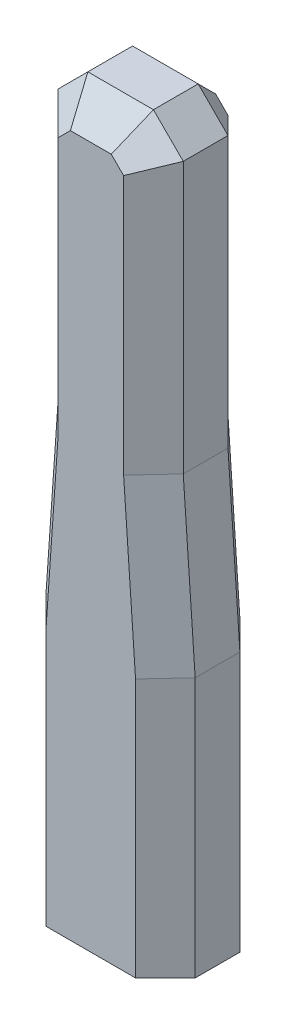
ISO-10303-21;
HEADER;
FILE_DESCRIPTION(('STEP AP214'),'2;1');
FILE_NAME('part.step','',(''),(''),'','','');
FILE_SCHEMA(('AUTOMOTIVE_DESIGN { 1 0 10303 214 1 1 1 1 }'));
ENDSEC;
DATA;
#1=APPLICATION_CONTEXT('core data for automotive mechanical design processes');
#2=APPLICATION_PROTOCOL_DEFINITION('international standard','automotive_design',2000,#1);
#3=PRODUCT_CONTEXT('',#1,'mechanical');
#4=PRODUCT('Part','Part','',(#3));
#5=PRODUCT_RELATED_PRODUCT_CATEGORY('part','',(#4));
#6=PRODUCT_DEFINITION_FORMATION('','',#4);
#7=PRODUCT_DEFINITION_CONTEXT('part definition',#1,'design');
#8=PRODUCT_DEFINITION('design','',#6,#7);
#9=PRODUCT_DEFINITION_SHAPE('','',#8);
#10=(LENGTH_UNIT() NAMED_UNIT(*) SI_UNIT(.MILLI.,.METRE.));
#11=(NAMED_UNIT(*) PLANE_ANGLE_UNIT() SI_UNIT($,.RADIAN.));
#12=(NAMED_UNIT(*) SI_UNIT($,.STERADIAN.) SOLID_ANGLE_UNIT());
#13=UNCERTAINTY_MEASURE_WITH_UNIT(LENGTH_MEASURE(1.E-05),#10,'distance_accuracy_value','');
#14=(GEOMETRIC_REPRESENTATION_CONTEXT(3) GLOBAL_UNCERTAINTY_ASSIGNED_CONTEXT((#13)) GLOBAL_UNIT_ASSIGNED_CONTEXT((#10,
#11,#12)) REPRESENTATION_CONTEXT('',''));
#15=CARTESIAN_POINT('',(0.,0.,0.));
#16=DIRECTION('',(0.,0.,1.));
#17=DIRECTION('',(1.,0.,0.));
#18=AXIS2_PLACEMENT_3D('',#15,#16,#17);
#19=CARTESIAN_POINT('',(-4.57999866713436,9.57202758637888,-16.9305140200779));
#20=DIRECTION('',(-0.707106781202286,0.,0.707106781170809));
#21=DIRECTION('',(0.,1.,0.));
#22=AXIS2_PLACEMENT_3D('',#19,#20,#21);
#23=PLANE('',#22);
#24=DIRECTION('',(0.,1.,0.));
#25=VECTOR('',#24,1.);
#26=CARTESIAN_POINT('',(-4.67999866713065,9.57202758637888,-17.0305140200786));
#27=LINE('',#26,#25);
#28=CARTESIAN_POINT('',(-4.67999866713065,8.65707008336893,-17.0305140200786));
#29=VERTEX_POINT('',#28);
#30=CARTESIAN_POINT('',(-4.67999866713065,10.39715822302,-17.0305140200786));
#31=VERTEX_POINT('',#30);
#32=EDGE_CURVE('E241',#29,#31,#27,.T.);
#33=ORIENTED_EDGE('',*,*,#32,.T.);
#34=DIRECTION('',(-0.678598344529951,-0.281084637718644,-0.678598344560159));
#35=VECTOR('',#34,1.);
#36=CARTESIAN_POINT('',(12.3505153521898,17.4514281042689,0.));
#37=LINE('',#36,#35);
#38=CARTESIAN_POINT('',(-4.47999866713806,10.4800009354946,-16.8305140200771));
#39=VERTEX_POINT('',#38);
#40=EDGE_CURVE('E11',#39,#31,#37,.T.);
#41=ORIENTED_EDGE('',*,*,#40,.F.);
#42=DIRECTION('',(0.,1.,0.));
#43=VECTOR('',#42,1.);
#44=CARTESIAN_POINT('',(-4.47999866713806,9.57202758637888,-16.8305140200771));
#45=LINE('',#44,#43);
#46=CARTESIAN_POINT('',(-4.47999866713806,8.66405423734772,-16.8305140200771));
#47=VERTEX_POINT('',#46);
#48=EDGE_CURVE('E342',#47,#39,#45,.T.);
#49=ORIENTED_EDGE('',*,*,#48,.F.);
#50=DIRECTION('',(0.706891307562466,0.0246851886921346,0.706891307593933));
#51=VECTOR('',#50,1.);
#52=CARTESIAN_POINT('',(12.3505153521898,9.25178874463048,0.));
#53=LINE('',#52,#51);
#54=EDGE_CURVE('E278',#29,#47,#53,.T.);
#55=ORIENTED_EDGE('',*,*,#54,.F.);
#56=EDGE_LOOP('',(#33,#41,#49,#55));
#57=FACE_BOUND('',#56,.T.);
#58=ADVANCED_FACE('F17',(#57),#23,.F.);
#59=CARTESIAN_POINT('',(-5.26024226203781,8.0850519393985,-16.9305140200829));
#60=DIRECTION('',(0.705384304599317,-0.0493252756452176,0.707106781191823));
#61=DIRECTION('',(-0.0697564737857785,-0.997564050256912,0.));
#62=AXIS2_PLACEMENT_3D('',#59,#60,#61);
#63=PLANE('',#62);
#64=DIRECTION('',(-0.0697564737852584,-0.997564050256948,-5.21242771167607E-13));
#65=VECTOR('',#64,1.);
#66=CARTESIAN_POINT('',(-5.16048585701137,8.07807629201998,-17.0305140200822));
#67=LINE('',#66,#65);
#68=CARTESIAN_POINT('',(-5.11999866703897,8.65707008314429,-17.0305140200819));
#69=VERTEX_POINT('',#68);
#70=CARTESIAN_POINT('',(-5.19999866708669,7.51301678260294,-17.0305140200825));
#71=VERTEX_POINT('',#70);
#72=EDGE_CURVE('E219',#69,#71,#67,.T.);
#73=ORIENTED_EDGE('',*,*,#72,.T.);
#74=DIRECTION('',(-0.706891307599591,0.0246851882049609,0.706891307573821));
#75=VECTOR('',#74,1.);
#76=CARTESIAN_POINT('',(0.,7.33142882928878,-22.2305126869796));
#77=LINE('',#76,#75);
#78=CARTESIAN_POINT('',(-5.39999866709248,7.52000093644391,-16.830514020084));
#79=VERTEX_POINT('',#78);
#80=EDGE_CURVE('E320',#71,#79,#77,.T.);
#81=ORIENTED_EDGE('',*,*,#80,.T.);
#82=DIRECTION('',(-0.0697564737852584,-0.997564050256948,-5.21242771167607E-13));
#83=VECTOR('',#82,1.);
#84=CARTESIAN_POINT('',(-5.35999866706426,8.09202758677703,-16.8305140200837));
#85=LINE('',#84,#83);
#86=CARTESIAN_POINT('',(-5.31999866704638,8.66405423696218,-16.8305140200834));
#87=VERTEX_POINT('',#86);
#88=EDGE_CURVE('E285',#87,#79,#85,.T.);
#89=ORIENTED_EDGE('',*,*,#88,.F.);
#90=DIRECTION('',(-0.706891307603859,0.024685188123522,0.706891307572397));
#91=VECTOR('',#90,1.);
#92=CARTESIAN_POINT('',(0.,8.47827579195905,-22.150512686893));
#93=LINE('',#92,#91);
#94=EDGE_CURVE('E468',#69,#87,#93,.T.);
#95=ORIENTED_EDGE('',*,*,#94,.F.);
#96=EDGE_LOOP('',(#73,#81,#89,#95));
#97=FACE_BOUND('',#96,.T.);
#98=ADVANCED_FACE('F730',(#97),#63,.F.);
#99=CARTESIAN_POINT('',(-5.14928798892254,10.5092902573774,-16.9305140200821));
#100=DIRECTION('',(0.499999999989489,-0.499999999994773,0.707106781197676));
#101=DIRECTION('',(-0.707106781190284,-0.707106781182811,0.));
#102=AXIS2_PLACEMENT_3D('',#99,#100,#101);
#103=PLANE('',#102);
#104=DIRECTION('',(-0.707106781186548,-0.707106781186547,-5.28366239649358E-12));
#105=VECTOR('',#104,1.);
#106=CARTESIAN_POINT('',(-5.07857731080166,10.4385795792573,-17.0305140200816));
#107=LINE('',#106,#105);
#108=CARTESIAN_POINT('',(-5.03715595456435,10.4800009354946,-17.0305140200813));
#109=VERTEX_POINT('',#108);
#110=CARTESIAN_POINT('',(-5.11999866703897,10.39715822302,-17.0305140200819));
#111=VERTEX_POINT('',#110);
#112=EDGE_CURVE('E218',#109,#111,#107,.T.);
#113=ORIENTED_EDGE('',*,*,#112,.T.);
#114=DIRECTION('',(-0.67859834456174,0.281084637710999,0.678598344531538));
#115=VECTOR('',#114,1.);
#116=CARTESIAN_POINT('',(0.,8.27638533587879,-22.150512686893));
#117=LINE('',#116,#115);
#118=CARTESIAN_POINT('',(-5.31999866704638,10.4800009354946,-16.8305140200834));
#119=VERTEX_POINT('',#118);
#120=EDGE_CURVE('E228',#111,#119,#117,.T.);
#121=ORIENTED_EDGE('',*,*,#120,.T.);
#122=DIRECTION('',(-0.707106781186548,-0.707106781186547,-5.28366239649358E-12));
#123=VECTOR('',#122,1.);
#124=CARTESIAN_POINT('',(-5.21999866704342,10.5800009354976,-16.8305140200826));
#125=LINE('',#124,#123);
#126=CARTESIAN_POINT('',(-5.11999866704638,10.6800009354946,-16.8305140200819));
#127=VERTEX_POINT('',#126);
#128=EDGE_CURVE('E186',#127,#119,#125,.T.);
#129=ORIENTED_EDGE('',*,*,#128,.F.);
#130=DIRECTION('',(0.281084637738371,-0.67859834454202,-0.678598344539919));
#131=VECTOR('',#130,1.);
#132=CARTESIAN_POINT('',(-0.696197433011564,0.,-27.5105149555435));
#133=LINE('',#132,#131);
#134=EDGE_CURVE('E272',#127,#109,#133,.T.);
#135=ORIENTED_EDGE('',*,*,#134,.T.);
#136=EDGE_LOOP('',(#113,#121,#129,#135));
#137=FACE_BOUND('',#136,.T.);
#138=ADVANCED_FACE('F709',(#137),#103,.F.);
#139=CARTESIAN_POINT('',(-4.65070934525154,10.5092902573745,-16.9305140200784));
#140=DIRECTION('',(-0.500000000010512,-0.500000000005229,0.707106781175417));
#141=DIRECTION('',(-0.707106781182812,0.707106781190283,0.));
#142=AXIS2_PLACEMENT_3D('',#139,#140,#141);
#143=PLANE('',#142);
#144=DIRECTION('',(-0.707106781186548,0.707106781186547,-5.2836901520692E-12));
#145=VECTOR('',#144,1.);
#146=CARTESIAN_POINT('',(-4.72142002336796,10.4385795792573,-17.0305140200789));
#147=LINE('',#146,#145);
#148=CARTESIAN_POINT('',(-4.76284137960527,10.4800009354946,-17.0305140200792));
#149=VERTEX_POINT('',#148);
#150=EDGE_CURVE('E237',#31,#149,#147,.T.);
#151=ORIENTED_EDGE('',*,*,#150,.T.);
#152=DIRECTION('',(0.281084637691265,0.678598344549675,0.678598344551776));
#153=VECTOR('',#152,1.);
#154=CARTESIAN_POINT('',(2.29142850104388,27.5105149555211,0.));
#155=LINE('',#154,#153);
#156=CARTESIAN_POINT('',(-4.67999866713806,10.6800009354946,-16.8305140200786));
#157=VERTEX_POINT('',#156);
#158=EDGE_CURVE('E28',#149,#157,#155,.T.);
#159=ORIENTED_EDGE('',*,*,#158,.T.);
#160=DIRECTION('',(-0.707106781186548,0.707106781186547,-5.2836901520692E-12));
#161=VECTOR('',#160,1.);
#162=CARTESIAN_POINT('',(-4.57999866713511,10.5800009354917,-16.8305140200779));
#163=LINE('',#162,#161);
#164=EDGE_CURVE('E367',#39,#157,#163,.T.);
#165=ORIENTED_EDGE('',*,*,#164,.F.);
#166=ORIENTED_EDGE('',*,*,#40,.T.);
#167=EDGE_LOOP('',(#151,#159,#165,#166));
#168=FACE_BOUND('',#167,.T.);
#169=ADVANCED_FACE('F740',(#168),#143,.F.);
#170=CARTESIAN_POINT('',(-4.49999866707397,6.80355429917033,-16.9305140200773));
#171=DIRECTION('',(0.707106781191832,-2.91564166507091E-11,-0.707106781181263));
#172=DIRECTION('',(0.,-1.,4.12333998579417E-11));
#173=AXIS2_PLACEMENT_3D('',#170,#171,#172);
#174=PLANE('',#173);
#175=DIRECTION('',(4.12333998576334E-11,1.,0.));
#176=VECTOR('',#175,1.);
#177=CARTESIAN_POINT('',(-4.59999866735376,0.,-17.030514020078));
#178=LINE('',#177,#176);
#179=CARTESIAN_POINT('',(-4.59999866711559,5.77610154549438,-17.030514020078));
#180=VERTEX_POINT('',#179);
#181=CARTESIAN_POINT('',(-4.59999866704398,7.51301678091455,-17.030514020078));
#182=VERTEX_POINT('',#181);
#183=EDGE_CURVE('E229',#180,#182,#178,.T.);
#184=ORIENTED_EDGE('',*,*,#183,.T.);
#185=DIRECTION('',(-0.706891307578902,-0.0246851883784887,-0.70689130758845));
#186=VECTOR('',#185,1.);
#187=CARTESIAN_POINT('',(12.430515352804,8.10773543462429,0.));
#188=LINE('',#187,#186);
#189=CARTESIAN_POINT('',(-4.39999866704518,7.5200009348046,-16.8305140200765));
#190=VERTEX_POINT('',#189);
#191=EDGE_CURVE('E277',#190,#182,#188,.T.);
#192=ORIENTED_EDGE('',*,*,#191,.F.);
#193=DIRECTION('',(4.12333998576334E-11,1.,0.));
#194=VECTOR('',#193,1.);
#195=CARTESIAN_POINT('',(-4.39999866735525,0.,-16.8305140200765));
#196=LINE('',#195,#194);
#197=CARTESIAN_POINT('',(-4.39999866711709,5.77610154549033,-16.8305140200765));
#198=VERTEX_POINT('',#197);
#199=EDGE_CURVE('E250',#198,#190,#196,.T.);
#200=ORIENTED_EDGE('',*,*,#199,.F.);
#201=DIRECTION('',(0.707106781181263,-1.43135781005554E-11,0.707106781191832));
#202=VECTOR('',#201,1.);
#203=CARTESIAN_POINT('',(12.430515352712,5.77610154514964,0.));
#204=LINE('',#203,#202);
#205=EDGE_CURVE('E296',#180,#198,#204,.T.);
#206=ORIENTED_EDGE('',*,*,#205,.F.);
#207=EDGE_LOOP('',(#184,#192,#200,#206));
#208=FACE_BOUND('',#207,.T.);
#209=ADVANCED_FACE('F449',(#208),#174,.T.);
#210=CARTESIAN_POINT('',(-4.89999866708556,10.5800009354946,-16.9305140200802));
#211=DIRECTION('',(5.28373977072025E-12,0.707106781186548,-0.707106781186548));
#212=DIRECTION('',(-1.,0.,-7.47233644380268E-12));
#213=AXIS2_PLACEMENT_3D('',#210,#211,#212);
#214=PLANE('',#213);
#215=DIRECTION('',(1.,0.,7.47224236090572E-12));
#216=VECTOR('',#215,1.);
#217=CARTESIAN_POINT('',(-4.89999866708481,10.4800009354946,-17.0305140200802));
#218=LINE('',#217,#216);
#219=EDGE_CURVE('E242',#109,#149,#218,.T.);
#220=ORIENTED_EDGE('',*,*,#219,.F.);
#221=ORIENTED_EDGE('',*,*,#134,.F.);
#222=DIRECTION('',(1.,0.,7.47224236090572E-12));
#223=VECTOR('',#222,1.);
#224=CARTESIAN_POINT('',(-4.89999866708631,10.6800009354946,-16.8305140200802));
#225=LINE('',#224,#223);
#226=EDGE_CURVE('E263',#127,#157,#225,.T.);
#227=ORIENTED_EDGE('',*,*,#226,.T.);
#228=ORIENTED_EDGE('',*,*,#158,.F.);
#229=EDGE_LOOP('',(#220,#221,#227,#228));
#230=FACE_BOUND('',#229,.T.);
#231=ADVANCED_FACE('F705',(#230),#214,.T.);
#232=CARTESIAN_POINT('',(-5.29999866710318,6.8035543000141,-16.9305140200832));
#233=DIRECTION('',(-0.707106781173423,1.34839291616587E-11,-0.707106781199672));
#234=DIRECTION('',(-0.707106781199672,0.,0.707106781173423));
#235=AXIS2_PLACEMENT_3D('',#232,#233,#234);
#236=PLANE('',#235);
#237=DIRECTION('',(0.707106781199672,-1.43124956331064E-11,-0.707106781173423));
#238=VECTOR('',#237,1.);
#239=CARTESIAN_POINT('',(-4.04831723699317E-12,5.77610154540127,-22.2305126870054));
#240=LINE('',#239,#238);
#241=CARTESIAN_POINT('',(-5.39999866712573,5.77610154551057,-16.830514020084));
#242=VERTEX_POINT('',#241);
#243=CARTESIAN_POINT('',(-5.19999866711992,5.77610154550652,-17.0305140200824));
#244=VERTEX_POINT('',#243);
#245=EDGE_CURVE('E326',#242,#244,#240,.T.);
#246=ORIENTED_EDGE('',*,*,#245,.F.);
#247=DIRECTION('',(1.90691554947072E-11,1.,0.));
#248=VECTOR('',#247,1.);
#249=CARTESIAN_POINT('',(-5.39999866710614,6.80355430001601,-16.830514020084));
#250=LINE('',#249,#248);
#251=EDGE_CURVE('E236',#242,#79,#250,.T.);
#252=ORIENTED_EDGE('',*,*,#251,.T.);
#253=ORIENTED_EDGE('',*,*,#80,.F.);
#254=DIRECTION('',(1.90691554947072E-11,1.,0.));
#255=VECTOR('',#254,1.);
#256=CARTESIAN_POINT('',(-5.19999866722995,0.,-17.0305140200825));
#257=LINE('',#256,#255);
#258=EDGE_CURVE('E224',#244,#71,#257,.T.);
#259=ORIENTED_EDGE('',*,*,#258,.F.);
#260=EDGE_LOOP('',(#246,#252,#253,#259));
#261=FACE_BOUND('',#260,.T.);
#262=ADVANCED_FACE('F439',(#261),#236,.T.);
#263=CARTESIAN_POINT('',(-4.49999866707771,6.80355429917033,-16.4305140200773));
#264=DIRECTION('',(-0.707106781181261,2.91564166507089E-11,-0.707106781191834));
#265=DIRECTION('',(-0.707106781191834,0.,0.707106781181261));
#266=AXIS2_PLACEMENT_3D('',#263,#264,#265);
#267=PLANE('',#266);
#268=DIRECTION('',(0.707106781191834,-1.43124956331064E-11,-0.707106781181261));
#269=VECTOR('',#268,1.);
#270=CARTESIAN_POINT('',(0.,5.77610154540127,-20.93051268713));
#271=LINE('',#270,#269);
#272=CARTESIAN_POINT('',(-4.59999866712083,5.77610154549438,-16.330514020078));
#273=VERTEX_POINT('',#272);
#274=CARTESIAN_POINT('',(-4.39999866711933,5.77610154549033,-16.5305140200765));
#275=VERTEX_POINT('',#274);
#276=EDGE_CURVE('E295',#273,#275,#271,.T.);
#277=ORIENTED_EDGE('',*,*,#276,.T.);
#278=DIRECTION('',(4.12333998576334E-11,1.,0.));
#279=VECTOR('',#278,1.);
#280=CARTESIAN_POINT('',(-4.3999986673575,0.,-16.5305140200765));
#281=LINE('',#280,#279);
#282=CARTESIAN_POINT('',(-4.39999866704743,7.52000093480464,-16.5305140200765));
#283=VERTEX_POINT('',#282);
#284=EDGE_CURVE('E253',#275,#283,#281,.T.);
#285=ORIENTED_EDGE('',*,*,#284,.T.);
#286=DIRECTION('',(-0.706891307589463,-0.0246851883788581,0.706891307577876));
#287=VECTOR('',#286,1.);
#288=CARTESIAN_POINT('',(0.,7.67365227383889,-20.9305126870518));
#289=LINE('',#288,#287);
#290=CARTESIAN_POINT('',(-4.5999986670492,7.5130167809145,-16.330514020078));
#291=VERTEX_POINT('',#290);
#292=EDGE_CURVE('E211',#283,#291,#289,.T.);
#293=ORIENTED_EDGE('',*,*,#292,.T.);
#294=DIRECTION('',(4.12333998576334E-11,1.,0.));
#295=VECTOR('',#294,1.);
#296=CARTESIAN_POINT('',(-4.59999866735899,0.,-16.330514020078));
#297=LINE('',#296,#295);
#298=EDGE_CURVE('E264',#273,#291,#297,.T.);
#299=ORIENTED_EDGE('',*,*,#298,.F.);
#300=EDGE_LOOP('',(#277,#285,#293,#299));
#301=FACE_BOUND('',#300,.T.);
#302=ADVANCED_FACE('F485',(#301),#267,.F.);
#303=CARTESIAN_POINT('',(-4.89999866711,10.5800009354946,-16.4305140200802));
#304=DIRECTION('',(5.28360671741137E-12,-0.707106781186548,-0.707106781186548));
#305=DIRECTION('',(0.,-0.707106781186548,0.707106781186548));
#306=AXIS2_PLACEMENT_3D('',#303,#304,#305);
#307=PLANE('',#306);
#308=DIRECTION('',(1.,0.,7.47224236090572E-12));
#309=VECTOR('',#308,1.);
#310=CARTESIAN_POINT('',(-4.89999866711074,10.4800009354946,-16.3305140200802));
#311=LINE('',#310,#309);
#312=CARTESIAN_POINT('',(-5.03715595459028,10.4800009354946,-16.3305140200813));
#313=VERTEX_POINT('',#312);
#314=CARTESIAN_POINT('',(-4.76284137963121,10.4800009354946,-16.3305140200792));
#315=VERTEX_POINT('',#314);
#316=EDGE_CURVE('E208',#313,#315,#311,.T.);
#317=ORIENTED_EDGE('',*,*,#316,.T.);
#318=DIRECTION('',(0.281084637738384,0.678598344542017,-0.678598344539917));
#319=VECTOR('',#318,1.);
#320=CARTESIAN_POINT('',(-9.10379990118421,0.,-5.85051308461704));
#321=LINE('',#320,#319);
#322=CARTESIAN_POINT('',(-4.67999866714918,10.6800009354946,-16.5305140200786));
#323=VERTEX_POINT('',#322);
#324=EDGE_CURVE('E73',#315,#323,#321,.T.);
#325=ORIENTED_EDGE('',*,*,#324,.T.);
#326=DIRECTION('',(1.,0.,7.47224236090572E-12));
#327=VECTOR('',#326,1.);
#328=CARTESIAN_POINT('',(-4.89999866710925,10.6800009354946,-16.5305140200802));
#329=LINE('',#328,#327);
#330=CARTESIAN_POINT('',(-5.11999866705749,10.6800009354946,-16.5305140200819));
#331=VERTEX_POINT('',#330);
#332=EDGE_CURVE('E262',#331,#323,#329,.T.);
#333=ORIENTED_EDGE('',*,*,#332,.F.);
#334=DIRECTION('',(0.28108463769128,-0.678598344549672,0.678598344551773));
#335=VECTOR('',#334,1.);
#336=CARTESIAN_POINT('',(1.72716443242579,-5.85051308453611,0.));
#337=LINE('',#336,#335);
#338=EDGE_CURVE('E246',#331,#313,#337,.T.);
#339=ORIENTED_EDGE('',*,*,#338,.T.);
#340=EDGE_LOOP('',(#317,#325,#333,#339));
#341=FACE_BOUND('',#340,.T.);
#342=ADVANCED_FACE('F715',(#341),#307,.F.);
#343=CARTESIAN_POINT('',(-4.53975507212827,8.08505193881158,-16.4305140200776));
#344=DIRECTION('',(0.705384304603381,0.0493252755870465,0.707106781191827));
#345=DIRECTION('',(0.0697564737035125,-0.997564050262664,0.));
#346=AXIS2_PLACEMENT_3D('',#343,#344,#345);
#347=PLANE('',#346);
#348=DIRECTION('',(-0.0697564737029925,0.9975640502627,-5.21235832273703E-13));
#349=VECTOR('',#348,1.);
#350=CARTESIAN_POINT('',(-4.63951147715529,8.07807629144128,-16.3305140200783));
#351=LINE('',#350,#349);
#352=CARTESIAN_POINT('',(-4.67999866715658,8.65707008366494,-16.3305140200786));
#353=VERTEX_POINT('',#352);
#354=EDGE_CURVE('E268',#291,#353,#351,.T.);
#355=ORIENTED_EDGE('',*,*,#354,.F.);
#356=ORIENTED_EDGE('',*,*,#292,.F.);
#357=DIRECTION('',(-0.0697564737029925,0.9975640502627,-5.21235832273703E-13));
#358=VECTOR('',#357,1.);
#359=CARTESIAN_POINT('',(-4.43999866710125,8.09202758618188,-16.5305140200768));
#360=LINE('',#359,#358);
#361=CARTESIAN_POINT('',(-4.47999866714917,8.66405423747462,-16.5305140200771));
#362=VERTEX_POINT('',#361);
#363=EDGE_CURVE('E235',#283,#362,#360,.T.);
#364=ORIENTED_EDGE('',*,*,#363,.T.);
#365=DIRECTION('',(-0.706891307604378,-0.0246851880942514,0.7068913075729));
#366=VECTOR('',#365,1.);
#367=CARTESIAN_POINT('',(0.,8.82049923626143,-21.0105126870268));
#368=LINE('',#367,#366);
#369=EDGE_CURVE('E249',#362,#353,#368,.T.);
#370=ORIENTED_EDGE('',*,*,#369,.T.);
#371=EDGE_LOOP('',(#355,#356,#364,#370));
#372=FACE_BOUND('',#371,.T.);
#373=ADVANCED_FACE('F402',(#372),#347,.T.);
#374=CARTESIAN_POINT('',(-5.2199986670612,9.57202758612268,-16.4305140200826));
#375=DIRECTION('',(-0.70710678120228,0.,0.707106781170815));
#376=DIRECTION('',(0.,1.,0.));
#377=AXIS2_PLACEMENT_3D('',#374,#375,#376);
#378=PLANE('',#377);
#379=DIRECTION('',(0.,-1.,0.));
#380=VECTOR('',#379,1.);
#381=CARTESIAN_POINT('',(-5.1199986670649,9.57202758612268,-16.3305140200819));
#382=LINE('',#381,#380);
#383=CARTESIAN_POINT('',(-5.1199986670649,10.39715822302,-16.3305140200819));
#384=VERTEX_POINT('',#383);
#385=CARTESIAN_POINT('',(-5.1199986670649,8.65707008284827,-16.3305140200819));
#386=VERTEX_POINT('',#385);
#387=EDGE_CURVE('E177',#384,#386,#382,.T.);
#388=ORIENTED_EDGE('',*,*,#387,.F.);
#389=DIRECTION('',(0.678598344529956,-0.281084637718647,0.678598344560153));
#390=VECTOR('',#389,1.);
#391=CARTESIAN_POINT('',(11.2105153522903,3.63283783542861,0.));
#392=LINE('',#391,#390);
#393=CARTESIAN_POINT('',(-5.3199986670575,10.4800009354946,-16.5305140200834));
#394=VERTEX_POINT('',#393);
#395=EDGE_CURVE('E42',#394,#384,#392,.T.);
#396=ORIENTED_EDGE('',*,*,#395,.F.);
#397=DIRECTION('',(0.,-1.,0.));
#398=VECTOR('',#397,1.);
#399=CARTESIAN_POINT('',(-5.31999866705749,9.57202758612268,-16.5305140200834));
#400=LINE('',#399,#398);
#401=CARTESIAN_POINT('',(-5.31999866705749,8.66405423683532,-16.5305140200834));
#402=VERTEX_POINT('',#401);
#403=EDGE_CURVE('E180',#394,#402,#400,.T.);
#404=ORIENTED_EDGE('',*,*,#403,.T.);
#405=DIRECTION('',(0.706891307561959,-0.0246851887215383,0.706891307593414));
#406=VECTOR('',#405,1.);
#407=CARTESIAN_POINT('',(11.2105153522903,8.0867959598323,0.));
#408=LINE('',#407,#406);
#409=EDGE_CURVE('E173',#402,#386,#408,.T.);
#410=ORIENTED_EDGE('',*,*,#409,.T.);
#411=EDGE_LOOP('',(#388,#396,#404,#410));
#412=FACE_BOUND('',#411,.T.);
#413=ADVANCED_FACE('F175',(#412),#378,.T.);
#414=CARTESIAN_POINT('',(-5.29999866711799,6.80355429990317,-16.4305140200832));
#415=DIRECTION('',(0.707106781199667,-1.34839291619576E-11,-0.707106781173428));
#416=DIRECTION('',(0.,-1.,1.90691554952723E-11));
#417=AXIS2_PLACEMENT_3D('',#414,#415,#416);
#418=PLANE('',#417);
#419=DIRECTION('',(1.90691554947072E-11,1.,0.));
#420=VECTOR('',#419,1.);
#421=CARTESIAN_POINT('',(-5.1999986672507,0.,-16.3305140200825));
#422=LINE('',#421,#420);
#423=CARTESIAN_POINT('',(-5.19999866714055,5.77610154550652,-16.3305140200825));
#424=VERTEX_POINT('',#423);
#425=CARTESIAN_POINT('',(-5.19999866710743,7.51301678238104,-16.3305140200825));
#426=VERTEX_POINT('',#425);
#427=EDGE_CURVE('E195',#424,#426,#422,.T.);
#428=ORIENTED_EDGE('',*,*,#427,.T.);
#429=DIRECTION('',(-0.706891307565523,0.0246851886535264,-0.706891307592225));
#430=VECTOR('',#429,1.);
#431=CARTESIAN_POINT('',(11.1305153523582,6.94274266093529,0.));
#432=LINE('',#431,#430);
#433=CARTESIAN_POINT('',(-5.39999866710137,7.52000093634887,-16.530514020084));
#434=VERTEX_POINT('',#433);
#435=EDGE_CURVE('E185',#426,#434,#432,.T.);
#436=ORIENTED_EDGE('',*,*,#435,.T.);
#437=DIRECTION('',(1.90691554947072E-11,1.,0.));
#438=VECTOR('',#437,1.);
#439=CARTESIAN_POINT('',(-5.39999866711503,6.80355429990507,-16.530514020084));
#440=LINE('',#439,#438);
#441=CARTESIAN_POINT('',(-5.39999866713463,5.77610154551057,-16.530514020084));
#442=VERTEX_POINT('',#441);
#443=EDGE_CURVE('E231',#442,#434,#440,.T.);
#444=ORIENTED_EDGE('',*,*,#443,.F.);
#445=DIRECTION('',(0.707106781173428,-1.43135781005554E-11,0.707106781199667));
#446=VECTOR('',#445,1.);
#447=CARTESIAN_POINT('',(11.1305153523359,5.77610154517595,0.));
#448=LINE('',#447,#446);
#449=EDGE_CURVE('E21',#442,#424,#448,.T.);
#450=ORIENTED_EDGE('',*,*,#449,.T.);
#451=EDGE_LOOP('',(#428,#436,#444,#450));
#452=FACE_BOUND('',#451,.T.);
#453=ADVANCED_FACE('F496',(#452),#418,.F.);
#454=CARTESIAN_POINT('',(-5.14928798894402,10.5092902573745,-16.4305140200821));
#455=DIRECTION('',(-0.500000000010507,0.500000000005224,0.707106781175424));
#456=DIRECTION('',(0.707106781182812,0.707106781190283,0.));
#457=AXIS2_PLACEMENT_3D('',#454,#455,#456);
#458=PLANE('',#457);
#459=DIRECTION('',(-0.707106781186548,-0.707106781186547,-5.28366239649358E-12));
#460=VECTOR('',#459,1.);
#461=CARTESIAN_POINT('',(-5.07857731082759,10.4385795792573,-16.3305140200816));
#462=LINE('',#461,#460);
#463=EDGE_CURVE('E201',#313,#384,#462,.T.);
#464=ORIENTED_EDGE('',*,*,#463,.F.);
#465=ORIENTED_EDGE('',*,*,#338,.F.);
#466=DIRECTION('',(-0.707106781186548,-0.707106781186547,-5.28366239649358E-12));
#467=VECTOR('',#466,1.);
#468=CARTESIAN_POINT('',(-5.21999866706045,10.5800009354917,-16.5305140200826));
#469=LINE('',#468,#467);
#470=EDGE_CURVE('E303',#331,#394,#469,.T.);
#471=ORIENTED_EDGE('',*,*,#470,.T.);
#472=ORIENTED_EDGE('',*,*,#395,.T.);
#473=EDGE_LOOP('',(#464,#465,#471,#472));
#474=FACE_BOUND('',#473,.T.);
#475=ADVANCED_FACE('F714',(#474),#458,.T.);
#476=CARTESIAN_POINT('',(-4.57999866715288,9.57202758652688,-16.4305140200779));
#477=DIRECTION('',(0.707106781170804,0.,0.707106781202291));
#478=DIRECTION('',(0.,-1.,0.));
#479=AXIS2_PLACEMENT_3D('',#476,#477,#478);
#480=PLANE('',#479);
#481=DIRECTION('',(0.,1.,0.));
#482=VECTOR('',#481,1.);
#483=CARTESIAN_POINT('',(-4.67999866715658,9.57202758652688,-16.3305140200786));
#484=LINE('',#483,#482);
#485=CARTESIAN_POINT('',(-4.67999866715658,10.39715822302,-16.3305140200786));
#486=VERTEX_POINT('',#485);
#487=EDGE_CURVE('E489',#353,#486,#484,.T.);
#488=ORIENTED_EDGE('',*,*,#487,.F.);
#489=ORIENTED_EDGE('',*,*,#369,.F.);
#490=DIRECTION('',(0.,1.,0.));
#491=VECTOR('',#490,1.);
#492=CARTESIAN_POINT('',(-4.47999866714917,9.57202758652688,-16.5305140200771));
#493=LINE('',#492,#491);
#494=CARTESIAN_POINT('',(-4.47999866714917,10.4800009354946,-16.5305140200771));
#495=VERTEX_POINT('',#494);
#496=EDGE_CURVE('E307',#362,#495,#493,.T.);
#497=ORIENTED_EDGE('',*,*,#496,.T.);
#498=DIRECTION('',(0.678598344561748,0.281084637710995,-0.678598344531531));
#499=VECTOR('',#498,1.);
#500=CARTESIAN_POINT('',(0.,12.3356771427724,-21.0105126870268));
#501=LINE('',#500,#499);
#502=EDGE_CURVE('E89',#486,#495,#501,.T.);
#503=ORIENTED_EDGE('',*,*,#502,.F.);
#504=EDGE_LOOP('',(#488,#489,#497,#503));
#505=FACE_BOUND('',#504,.T.);
#506=ADVANCED_FACE('F716',(#505),#480,.T.);
#507=CARTESIAN_POINT('',(-4.65070934527301,10.5092902573774,-16.4305140200784));
#508=DIRECTION('',(0.499999999989485,0.499999999994769,0.707106781197681));
#509=DIRECTION('',(0.707106781190284,-0.707106781182811,0.));
#510=AXIS2_PLACEMENT_3D('',#507,#508,#509);
#511=PLANE('',#510);
#512=DIRECTION('',(-0.707106781186548,0.707106781186547,-5.2836901520692E-12));
#513=VECTOR('',#512,1.);
#514=CARTESIAN_POINT('',(-4.72142002339389,10.4385795792573,-16.3305140200789));
#515=LINE('',#514,#513);
#516=EDGE_CURVE('E476',#486,#315,#515,.T.);
#517=ORIENTED_EDGE('',*,*,#516,.F.);
#518=ORIENTED_EDGE('',*,*,#502,.T.);
#519=DIRECTION('',(-0.707106781186548,0.707106781186547,-5.2836901520692E-12));
#520=VECTOR('',#519,1.);
#521=CARTESIAN_POINT('',(-4.57999866715213,10.5800009354976,-16.5305140200779));
#522=LINE('',#521,#520);
#523=EDGE_CURVE('E315',#495,#323,#522,.T.);
#524=ORIENTED_EDGE('',*,*,#523,.T.);
#525=ORIENTED_EDGE('',*,*,#324,.F.);
#526=EDGE_LOOP('',(#517,#518,#524,#525));
#527=FACE_BOUND('',#526,.T.);
#528=ADVANCED_FACE('F693',(#527),#511,.T.);
#529=CARTESIAN_POINT('',(-5.26024226205966,8.08505193913957,-16.4305140200829));
#530=DIRECTION('',(-0.705384304609883,0.0493252756452174,0.707106781181283));
#531=DIRECTION('',(0.0697564737847384,0.997564050256984,0.));
#532=AXIS2_PLACEMENT_3D('',#529,#530,#531);
#533=PLANE('',#532);
#534=DIRECTION('',(-0.0697564737852584,-0.997564050256948,-5.21242771167607E-13));
#535=VECTOR('',#534,1.);
#536=CARTESIAN_POINT('',(-5.16048585703471,8.07807629176104,-16.3305140200822));
#537=LINE('',#536,#535);
#538=EDGE_CURVE('E189',#386,#426,#537,.T.);
#539=ORIENTED_EDGE('',*,*,#538,.F.);
#540=ORIENTED_EDGE('',*,*,#409,.F.);
#541=DIRECTION('',(-0.0697564737852584,-0.997564050256948,-5.21242771167607E-13));
#542=VECTOR('',#541,1.);
#543=CARTESIAN_POINT('',(-5.3599986670846,8.09202758651809,-16.5305140200837));
#544=LINE('',#543,#542);
#545=EDGE_CURVE('E308',#402,#434,#544,.T.);
#546=ORIENTED_EDGE('',*,*,#545,.T.);
#547=ORIENTED_EDGE('',*,*,#435,.F.);
#548=EDGE_LOOP('',(#539,#540,#546,#547));
#549=FACE_BOUND('',#548,.T.);
#550=ADVANCED_FACE('F190',(#549),#533,.T.);
#551=CARTESIAN_POINT('',(-5.21999866705194,10.5800009354946,-16.6805140200797));
#552=DIRECTION('',(0.707106781186547,-0.707106781186548,2.61921692528065E-11));
#553=DIRECTION('',(0.,-3.70413209852905E-11,-1.));
#554=AXIS2_PLACEMENT_3D('',#551,#552,#553);
#555=PLANE('',#554);
#556=DIRECTION('',(-3.70413209852906E-11,0.,1.));
#557=VECTOR('',#556,1.);
#558=CARTESIAN_POINT('',(-5.3199986676698,10.4800009354946,0.));
#559=LINE('',#558,#557);
#560=EDGE_CURVE('E300',#119,#394,#559,.T.);
#561=ORIENTED_EDGE('',*,*,#560,.T.);
#562=ORIENTED_EDGE('',*,*,#470,.F.);
#563=DIRECTION('',(3.70413209852906E-11,0.,-1.));
#564=VECTOR('',#563,1.);
#565=CARTESIAN_POINT('',(-5.1199986676698,10.6800009354946,0.));
#566=LINE('',#565,#564);
#567=EDGE_CURVE('E258',#331,#127,#566,.T.);
#568=ORIENTED_EDGE('',*,*,#567,.T.);
#569=ORIENTED_EDGE('',*,*,#128,.T.);
#570=EDGE_LOOP('',(#561,#562,#568,#569));
#571=FACE_BOUND('',#570,.T.);
#572=ADVANCED_FACE('F713',(#571),#555,.F.);
#573=CARTESIAN_POINT('',(-5.31999866704358,7.82000093549501,-16.906249951394));
#574=DIRECTION('',(1.,0.,3.70413209852906E-11));
#575=DIRECTION('',(-3.70413209852906E-11,0.,1.));
#576=AXIS2_PLACEMENT_3D('',#573,#574,#575);
#577=PLANE('',#576);
#578=DIRECTION('',(0.,1.,0.));
#579=VECTOR('',#578,1.);
#580=CARTESIAN_POINT('',(-5.31999866704638,9.57202758627068,-16.8305140200834));
#581=LINE('',#580,#579);
#582=EDGE_CURVE('E225',#87,#119,#581,.T.);
#583=ORIENTED_EDGE('',*,*,#582,.F.);
#584=DIRECTION('',(-3.70413209852906E-11,-4.22857524675238E-10,1.));
#585=VECTOR('',#584,1.);
#586=CARTESIAN_POINT('',(-5.31999866766981,8.66405422984527,0.));
#587=LINE('',#586,#585);
#588=EDGE_CURVE('E290',#87,#402,#587,.T.);
#589=ORIENTED_EDGE('',*,*,#588,.T.);
#590=ORIENTED_EDGE('',*,*,#403,.F.);
#591=ORIENTED_EDGE('',*,*,#560,.F.);
#592=EDGE_LOOP('',(#583,#589,#590,#591));
#593=FACE_BOUND('',#592,.T.);
#594=ADVANCED_FACE('F767',(#593),#577,.F.);
#595=CARTESIAN_POINT('',(-4.9929986669714,4.40000093549462,-16.3305140200809));
#596=DIRECTION('',(7.47224236090572E-12,0.,-1.));
#597=DIRECTION('',(0.,-1.,0.));
#598=AXIS2_PLACEMENT_3D('',#595,#596,#597);
#599=PLANE('',#598);
#600=DIRECTION('',(-1.,2.0241729503846E-11,-7.47224236090572E-12));
#601=VECTOR('',#600,1.);
#602=CARTESIAN_POINT('',(0.,5.77610154540127,-16.3305140200436));
#603=LINE('',#602,#601);
#604=EDGE_CURVE('E462',#273,#424,#603,.T.);
#605=ORIENTED_EDGE('',*,*,#604,.F.);
#606=ORIENTED_EDGE('',*,*,#298,.T.);
#607=ORIENTED_EDGE('',*,*,#354,.T.);
#608=ORIENTED_EDGE('',*,*,#487,.T.);
#609=ORIENTED_EDGE('',*,*,#516,.T.);
#610=ORIENTED_EDGE('',*,*,#316,.F.);
#611=ORIENTED_EDGE('',*,*,#463,.T.);
#612=ORIENTED_EDGE('',*,*,#387,.T.);
#613=ORIENTED_EDGE('',*,*,#538,.T.);
#614=ORIENTED_EDGE('',*,*,#427,.F.);
#615=EDGE_LOOP('',(#605,#606,#607,#608,#609,#610,#611,#612,#613,#614));
#616=FACE_BOUND('',#615,.T.);
#617=ADVANCED_FACE('F198',(#616),#599,.F.);
#618=CARTESIAN_POINT('',(-4.39999866703251,7.79096993214436,-17.0311230200769));
#619=DIRECTION('',(1.,-4.12333998576334E-11,7.47224236090572E-12));
#620=DIRECTION('',(-4.12333998576334E-11,-1.,0.));
#621=AXIS2_PLACEMENT_3D('',#618,#619,#620);
#622=PLANE('',#621);
#623=ORIENTED_EDGE('',*,*,#199,.T.);
#624=DIRECTION('',(-7.47224236090572E-12,0.,1.));
#625=VECTOR('',#624,1.);
#626=CARTESIAN_POINT('',(-4.39999866717094,7.5200009348046,0.));
#627=LINE('',#626,#625);
#628=EDGE_CURVE('E254',#190,#283,#627,.T.);
#629=ORIENTED_EDGE('',*,*,#628,.T.);
#630=ORIENTED_EDGE('',*,*,#284,.F.);
#631=DIRECTION('',(-7.47224236090575E-12,0.,1.));
#632=VECTOR('',#631,1.);
#633=CARTESIAN_POINT('',(-4.39999866723865,5.77610154549032,0.));
#634=LINE('',#633,#632);
#635=EDGE_CURVE('E291',#198,#275,#634,.T.);
#636=ORIENTED_EDGE('',*,*,#635,.F.);
#637=EDGE_LOOP('',(#623,#629,#630,#636));
#638=FACE_BOUND('',#637,.T.);
#639=ADVANCED_FACE('F392',(#638),#622,.T.);
#640=CARTESIAN_POINT('',(-4.39999866704372,7.52000093527577,-21.4345140208122));
#641=DIRECTION('',(-0.9975640502627,-0.0697564737029925,-7.45404035408963E-12));
#642=DIRECTION('',(-0.0697564737029925,0.9975640502627,0.));
#643=AXIS2_PLACEMENT_3D('',#640,#641,#642);
#644=PLANE('',#643);
#645=DIRECTION('',(3.70413209852905E-11,-4.22857525176364E-10,-1.));
#646=VECTOR('',#645,1.);
#647=CARTESIAN_POINT('',(-4.47999866776148,8.66405424446463,0.));
#648=LINE('',#647,#646);
#649=EDGE_CURVE('E351',#362,#47,#648,.T.);
#650=ORIENTED_EDGE('',*,*,#649,.F.);
#651=ORIENTED_EDGE('',*,*,#363,.F.);
#652=ORIENTED_EDGE('',*,*,#628,.F.);
#653=DIRECTION('',(-0.0697564737029925,0.9975640502627,-5.21235832273703E-13));
#654=VECTOR('',#653,1.);
#655=CARTESIAN_POINT('',(-4.43999866708866,8.09202758603388,-16.8305140200768));
#656=LINE('',#655,#654);
#657=EDGE_CURVE('E273',#190,#47,#656,.T.);
#658=ORIENTED_EDGE('',*,*,#657,.T.);
#659=EDGE_LOOP('',(#650,#651,#652,#658));
#660=FACE_BOUND('',#659,.T.);
#661=ADVANCED_FACE('F398',(#660),#644,.F.);
#662=CARTESIAN_POINT('',(-5.39999866731364,1.58755360820651,-13.1851230208011));
#663=DIRECTION('',(-1.,1.90691554947072E-11,-2.96364078999419E-11));
#664=DIRECTION('',(-2.96364078999419E-11,0.,1.));
#665=AXIS2_PLACEMENT_3D('',#662,#663,#664);
#666=PLANE('',#665);
#667=ORIENTED_EDGE('',*,*,#251,.F.);
#668=DIRECTION('',(2.96364078999419E-11,0.,-1.));
#669=VECTOR('',#668,1.);
#670=CARTESIAN_POINT('',(-5.39999866762476,5.77610154551056,0.));
#671=LINE('',#670,#669);
#672=EDGE_CURVE('E330',#442,#242,#671,.T.);
#673=ORIENTED_EDGE('',*,*,#672,.F.);
#674=ORIENTED_EDGE('',*,*,#443,.T.);
#675=DIRECTION('',(2.96364079059861E-11,3.16962334130892E-10,-1.));
#676=VECTOR('',#675,1.);
#677=CARTESIAN_POINT('',(-5.39999866759127,7.52000093110927,0.));
#678=LINE('',#677,#676);
#679=EDGE_CURVE('E311',#434,#79,#678,.T.);
#680=ORIENTED_EDGE('',*,*,#679,.T.);
#681=EDGE_LOOP('',(#667,#673,#674,#680));
#682=FACE_BOUND('',#681,.T.);
#683=ADVANCED_FACE('F929',(#682),#666,.T.);
#684=CARTESIAN_POINT('',(-4.57999866714362,10.5800009354946,-16.6805140200808));
#685=DIRECTION('',(-0.707106781186547,-0.707106781186548,-2.61921692528065E-11));
#686=DIRECTION('',(-0.707106781186548,0.707106781186547,0.));
#687=AXIS2_PLACEMENT_3D('',#684,#685,#686);
#688=PLANE('',#687);
#689=DIRECTION('',(3.70413209852906E-11,0.,-1.));
#690=VECTOR('',#689,1.);
#691=CARTESIAN_POINT('',(-4.47999866776148,10.4800009354946,0.));
#692=LINE('',#691,#690);
#693=EDGE_CURVE('E319',#495,#39,#692,.T.);
#694=ORIENTED_EDGE('',*,*,#693,.T.);
#695=ORIENTED_EDGE('',*,*,#164,.T.);
#696=DIRECTION('',(-3.70413209852906E-11,0.,1.));
#697=VECTOR('',#696,1.);
#698=CARTESIAN_POINT('',(-4.67999866776149,10.6800009354946,0.));
#699=LINE('',#698,#697);
#700=EDGE_CURVE('E289',#157,#323,#699,.T.);
#701=ORIENTED_EDGE('',*,*,#700,.T.);
#702=ORIENTED_EDGE('',*,*,#523,.F.);
#703=EDGE_LOOP('',(#694,#695,#701,#702));
#704=FACE_BOUND('',#703,.T.);
#705=ADVANCED_FACE('F19',(#704),#688,.F.);
#706=CARTESIAN_POINT('',(-5.04299866690911,10.6800009354946,-17.031123020079));
#707=DIRECTION('',(0.,1.,0.));
#708=DIRECTION('',(1.,0.,0.));
#709=AXIS2_PLACEMENT_3D('',#706,#707,#708);
#710=PLANE('',#709);
#711=ORIENTED_EDGE('',*,*,#700,.F.);
#712=ORIENTED_EDGE('',*,*,#226,.F.);
#713=ORIENTED_EDGE('',*,*,#567,.F.);
#714=ORIENTED_EDGE('',*,*,#332,.T.);
#715=EDGE_LOOP('',(#711,#712,#713,#714));
#716=FACE_BOUND('',#715,.T.);
#717=ADVANCED_FACE('F698',(#716),#710,.T.);
#718=CARTESIAN_POINT('',(-5.39999866704372,7.52000093664918,-21.4345140208122));
#719=DIRECTION('',(0.997564050256948,-0.0697564737852584,7.45404035404664E-12));
#720=DIRECTION('',(0.,-1.06858044129259E-10,-1.));
#721=AXIS2_PLACEMENT_3D('',#718,#719,#720);
#722=PLANE('',#721);
#723=ORIENTED_EDGE('',*,*,#679,.F.);
#724=ORIENTED_EDGE('',*,*,#545,.F.);
#725=ORIENTED_EDGE('',*,*,#588,.F.);
#726=ORIENTED_EDGE('',*,*,#88,.T.);
#727=EDGE_LOOP('',(#723,#724,#725,#726));
#728=FACE_BOUND('',#727,.T.);
#729=ADVANCED_FACE('F766',(#728),#722,.F.);
#730=CARTESIAN_POINT('',(-4.47999866715198,7.82000093549501,-16.4547780888388));
#731=DIRECTION('',(-1.,0.,-3.70413209852906E-11));
#732=DIRECTION('',(-3.70413209852906E-11,0.,1.));
#733=AXIS2_PLACEMENT_3D('',#730,#731,#732);
#734=PLANE('',#733);
#735=ORIENTED_EDGE('',*,*,#496,.F.);
#736=ORIENTED_EDGE('',*,*,#649,.T.);
#737=ORIENTED_EDGE('',*,*,#48,.T.);
#738=ORIENTED_EDGE('',*,*,#693,.F.);
#739=EDGE_LOOP('',(#735,#736,#737,#738));
#740=FACE_BOUND('',#739,.T.);
#741=ADVANCED_FACE('F763',(#740),#734,.F.);
#742=CARTESIAN_POINT('',(-4.53975507211419,8.08505193866358,-16.9305140200776));
#743=DIRECTION('',(-0.705384304613965,-0.0493252755870476,0.707106781181269));
#744=DIRECTION('',(-0.0697564737024725,0.997564050262737,0.));
#745=AXIS2_PLACEMENT_3D('',#742,#743,#744);
#746=PLANE('',#745);
#747=DIRECTION('',(-0.0697564737029925,0.9975640502627,-5.21235832273703E-13));
#748=VECTOR('',#747,1.);
#749=CARTESIAN_POINT('',(-4.63951147713971,8.07807629129328,-17.0305140200783));
#750=LINE('',#749,#748);
#751=EDGE_CURVE('E282',#182,#29,#750,.T.);
#752=ORIENTED_EDGE('',*,*,#751,.T.);
#753=ORIENTED_EDGE('',*,*,#54,.T.);
#754=ORIENTED_EDGE('',*,*,#657,.F.);
#755=ORIENTED_EDGE('',*,*,#191,.T.);
#756=EDGE_LOOP('',(#752,#753,#754,#755));
#757=FACE_BOUND('',#756,.T.);
#758=ADVANCED_FACE('F747',(#757),#746,.F.);
#759=CARTESIAN_POINT('',(-4.82999866657846,5.77610154549903,-16.3674619892979));
#760=DIRECTION('',(2.0241729503846E-11,1.,0.));
#761=DIRECTION('',(1.,-2.0241729503846E-11,0.));
#762=AXIS2_PLACEMENT_3D('',#759,#760,#761);
#763=PLANE('',#762);
#764=ORIENTED_EDGE('',*,*,#449,.F.);
#765=ORIENTED_EDGE('',*,*,#672,.T.);
#766=ORIENTED_EDGE('',*,*,#245,.T.);
#767=DIRECTION('',(1.,-2.0241729503846E-11,7.47224236090572E-12));
#768=VECTOR('',#767,1.);
#769=CARTESIAN_POINT('',(-4.04831723699317E-12,5.77610154540127,-17.0305140200436));
#770=LINE('',#769,#768);
#771=EDGE_CURVE('E220',#244,#180,#770,.T.);
#772=ORIENTED_EDGE('',*,*,#771,.T.);
#773=ORIENTED_EDGE('',*,*,#205,.T.);
#774=ORIENTED_EDGE('',*,*,#635,.T.);
#775=ORIENTED_EDGE('',*,*,#276,.F.);
#776=ORIENTED_EDGE('',*,*,#604,.T.);
#777=EDGE_LOOP('',(#764,#765,#766,#772,#773,#774,#775,#776));
#778=FACE_BOUND('',#777,.T.);
#779=ADVANCED_FACE('F433',(#778),#763,.F.);
#780=CARTESIAN_POINT('',(-5.21999866704268,9.57202758627068,-16.9305140200826));
#781=DIRECTION('',(0.707106781170812,0.,0.707106781202283));
#782=DIRECTION('',(0.,-1.,0.));
#783=AXIS2_PLACEMENT_3D('',#780,#781,#782);
#784=PLANE('',#783);
#785=ORIENTED_EDGE('',*,*,#582,.T.);
#786=ORIENTED_EDGE('',*,*,#120,.F.);
#787=DIRECTION('',(0.,1.,0.));
#788=VECTOR('',#787,1.);
#789=CARTESIAN_POINT('',(-5.11999866703897,9.57202758627068,-17.0305140200819));
#790=LINE('',#789,#788);
#791=EDGE_CURVE('E214',#69,#111,#790,.T.);
#792=ORIENTED_EDGE('',*,*,#791,.F.);
#793=ORIENTED_EDGE('',*,*,#94,.T.);
#794=EDGE_LOOP('',(#785,#786,#792,#793));
#795=FACE_BOUND('',#794,.T.);
#796=ADVANCED_FACE('F746',(#795),#784,.F.);
#797=CARTESIAN_POINT('',(-4.99299866696617,4.40000093549462,-17.0305140200809));
#798=DIRECTION('',(7.47224236090572E-12,0.,-1.));
#799=DIRECTION('',(0.,-1.,0.));
#800=AXIS2_PLACEMENT_3D('',#797,#798,#799);
#801=PLANE('',#800);
#802=ORIENTED_EDGE('',*,*,#771,.F.);
#803=ORIENTED_EDGE('',*,*,#258,.T.);
#804=ORIENTED_EDGE('',*,*,#72,.F.);
#805=ORIENTED_EDGE('',*,*,#791,.T.);
#806=ORIENTED_EDGE('',*,*,#112,.F.);
#807=ORIENTED_EDGE('',*,*,#219,.T.);
#808=ORIENTED_EDGE('',*,*,#150,.F.);
#809=ORIENTED_EDGE('',*,*,#32,.F.);
#810=ORIENTED_EDGE('',*,*,#751,.F.);
#811=ORIENTED_EDGE('',*,*,#183,.F.);
#812=EDGE_LOOP('',(#802,#803,#804,#805,#806,#807,#808,#809,#810,#811));
#813=FACE_BOUND('',#812,.T.);
#814=ADVANCED_FACE('F445',(#813),#801,.T.);
#815=CLOSED_SHELL('',(#58,#98,#138,#169,#209,#231,#262,#302,#342,#373,#413,#453,#475,#506,#528,
#550,#572,#594,#617,#639,#661,#683,#705,#717,#729,#741,#758,#779,#796,#814));
#816=MANIFOLD_SOLID_BREP('B1',#815);
#817=ADVANCED_BREP_SHAPE_REPRESENTATION('',(#18,#816),#14);
#818=SHAPE_DEFINITION_REPRESENTATION(#9,#817);
ENDSEC;
END-ISO-10303-21;
